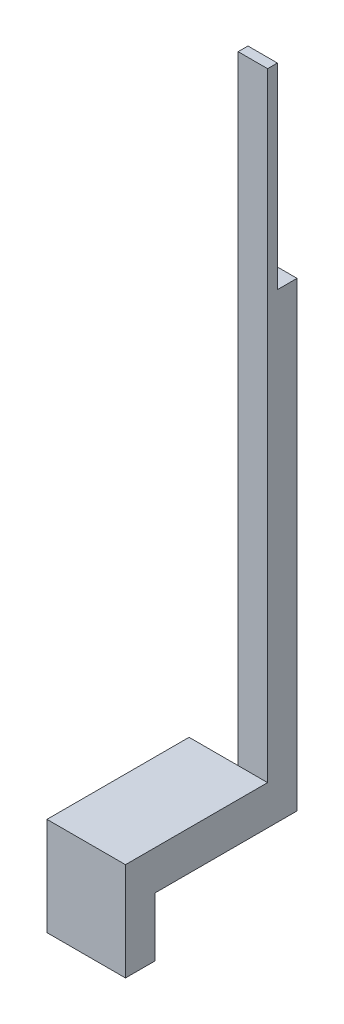
ISO-10303-21;
HEADER;
FILE_DESCRIPTION(('STEP AP214'),'2;1');
FILE_NAME('part.step','',(''),(''),'','','');
FILE_SCHEMA(('AUTOMOTIVE_DESIGN { 1 0 10303 214 1 1 1 1 }'));
ENDSEC;
DATA;
#1=APPLICATION_CONTEXT('core data for automotive mechanical design processes');
#2=APPLICATION_PROTOCOL_DEFINITION('international standard','automotive_design',2000,#1);
#3=PRODUCT_CONTEXT('',#1,'mechanical');
#4=PRODUCT('Part','Part','',(#3));
#5=PRODUCT_RELATED_PRODUCT_CATEGORY('part','',(#4));
#6=PRODUCT_DEFINITION_FORMATION('','',#4);
#7=PRODUCT_DEFINITION_CONTEXT('part definition',#1,'design');
#8=PRODUCT_DEFINITION('design','',#6,#7);
#9=PRODUCT_DEFINITION_SHAPE('','',#8);
#10=(LENGTH_UNIT() NAMED_UNIT(*) SI_UNIT(.MILLI.,.METRE.));
#11=(NAMED_UNIT(*) PLANE_ANGLE_UNIT() SI_UNIT($,.RADIAN.));
#12=(NAMED_UNIT(*) SI_UNIT($,.STERADIAN.) SOLID_ANGLE_UNIT());
#13=UNCERTAINTY_MEASURE_WITH_UNIT(LENGTH_MEASURE(1.E-05),#10,'distance_accuracy_value','');
#14=(GEOMETRIC_REPRESENTATION_CONTEXT(3) GLOBAL_UNCERTAINTY_ASSIGNED_CONTEXT((#13)) GLOBAL_UNIT_ASSIGNED_CONTEXT((#10,
#11,#12)) REPRESENTATION_CONTEXT('',''));
#15=CARTESIAN_POINT('',(0.,0.,0.));
#16=DIRECTION('',(0.,0.,1.));
#17=DIRECTION('',(1.,0.,0.));
#18=AXIS2_PLACEMENT_3D('',#15,#16,#17);
#19=CARTESIAN_POINT('',(0.,0.,3.));
#20=DIRECTION('',(1.,0.,0.));
#21=DIRECTION('',(0.,0.,-1.));
#22=AXIS2_PLACEMENT_3D('',#19,#20,#21);
#23=PLANE('',#22);
#24=DIRECTION('',(0.,-1.,0.));
#25=VECTOR('',#24,1.);
#26=CARTESIAN_POINT('',(0.,4.,3.));
#27=LINE('',#26,#25);
#28=CARTESIAN_POINT('',(0.,4.,3.));
#29=VERTEX_POINT('',#28);
#30=CARTESIAN_POINT('',(0.,0.,3.));
#31=VERTEX_POINT('',#30);
#32=EDGE_CURVE('E146',#29,#31,#27,.T.);
#33=ORIENTED_EDGE('',*,*,#32,.F.);
#34=DIRECTION('',(0.,-1.,0.));
#35=VECTOR('',#34,1.);
#36=CARTESIAN_POINT('',(0.,0.,3.));
#37=LINE('',#36,#35);
#38=CARTESIAN_POINT('',(0.,67.,3.));
#39=VERTEX_POINT('',#38);
#40=EDGE_CURVE('E195',#39,#29,#37,.T.);
#41=ORIENTED_EDGE('',*,*,#40,.F.);
#42=DIRECTION('',(0.,0.,1.));
#43=VECTOR('',#42,1.);
#44=CARTESIAN_POINT('',(0.,67.,3.));
#45=LINE('',#44,#43);
#46=CARTESIAN_POINT('',(0.,67.,2.));
#47=VERTEX_POINT('',#46);
#48=EDGE_CURVE('E177',#47,#39,#45,.T.);
#49=ORIENTED_EDGE('',*,*,#48,.F.);
#50=DIRECTION('',(0.,-1.,0.));
#51=VECTOR('',#50,1.);
#52=CARTESIAN_POINT('',(0.,67.,2.));
#53=LINE('',#52,#51);
#54=CARTESIAN_POINT('',(0.,47.,2.));
#55=VERTEX_POINT('',#54);
#56=EDGE_CURVE('E187',#47,#55,#53,.T.);
#57=ORIENTED_EDGE('',*,*,#56,.T.);
#58=DIRECTION('',(0.,0.,-1.));
#59=VECTOR('',#58,1.);
#60=CARTESIAN_POINT('',(0.,47.,3.));
#61=LINE('',#60,#59);
#62=CARTESIAN_POINT('',(0.,47.,0.));
#63=VERTEX_POINT('',#62);
#64=EDGE_CURVE('E200',#55,#63,#61,.T.);
#65=ORIENTED_EDGE('',*,*,#64,.T.);
#66=DIRECTION('',(0.,-1.,0.));
#67=VECTOR('',#66,1.);
#68=CARTESIAN_POINT('',(0.,0.,0.));
#69=LINE('',#68,#67);
#70=CARTESIAN_POINT('',(0.,0.,0.));
#71=VERTEX_POINT('',#70);
#72=EDGE_CURVE('E194',#63,#71,#69,.T.);
#73=ORIENTED_EDGE('',*,*,#72,.T.);
#74=DIRECTION('',(0.,0.,-1.));
#75=VECTOR('',#74,1.);
#76=CARTESIAN_POINT('',(0.,0.,3.));
#77=LINE('',#76,#75);
#78=EDGE_CURVE('E11',#31,#71,#77,.T.);
#79=ORIENTED_EDGE('',*,*,#78,.F.);
#80=EDGE_LOOP('',(#33,#41,#49,#57,#65,#73,#79));
#81=FACE_BOUND('',#80,.T.);
#82=ADVANCED_FACE('F33',(#81),#23,.F.);
#83=CARTESIAN_POINT('',(0.,0.,3.));
#84=DIRECTION('',(0.,0.,-1.));
#85=DIRECTION('',(-1.,0.,0.));
#86=AXIS2_PLACEMENT_3D('',#83,#84,#85);
#87=PLANE('',#86);
#88=DIRECTION('',(-1.,0.,0.));
#89=VECTOR('',#88,1.);
#90=CARTESIAN_POINT('',(0.,4.,3.));
#91=LINE('',#90,#89);
#92=CARTESIAN_POINT('',(3.,4.,3.));
#93=VERTEX_POINT('',#92);
#94=EDGE_CURVE('E47',#93,#29,#91,.T.);
#95=ORIENTED_EDGE('',*,*,#94,.F.);
#96=DIRECTION('',(0.,1.,0.));
#97=VECTOR('',#96,1.);
#98=CARTESIAN_POINT('',(3.,0.,3.));
#99=LINE('',#98,#97);
#100=CARTESIAN_POINT('',(3.,67.,3.));
#101=VERTEX_POINT('',#100);
#102=EDGE_CURVE('E197',#93,#101,#99,.T.);
#103=ORIENTED_EDGE('',*,*,#102,.T.);
#104=DIRECTION('',(1.,0.,0.));
#105=VECTOR('',#104,1.);
#106=CARTESIAN_POINT('',(0.,67.,3.));
#107=LINE('',#106,#105);
#108=EDGE_CURVE('E180',#39,#101,#107,.T.);
#109=ORIENTED_EDGE('',*,*,#108,.F.);
#110=ORIENTED_EDGE('',*,*,#40,.T.);
#111=EDGE_LOOP('',(#95,#103,#109,#110));
#112=FACE_BOUND('',#111,.T.);
#113=ADVANCED_FACE('F250',(#112),#87,.F.);
#114=CARTESIAN_POINT('',(0.,47.,3.));
#115=DIRECTION('',(0.,-1.,0.));
#116=DIRECTION('',(0.,0.,-1.));
#117=AXIS2_PLACEMENT_3D('',#114,#115,#116);
#118=PLANE('',#117);
#119=DIRECTION('',(-1.,0.,0.));
#120=VECTOR('',#119,1.);
#121=CARTESIAN_POINT('',(0.,47.,2.));
#122=LINE('',#121,#120);
#123=CARTESIAN_POINT('',(3.,47.,2.));
#124=VERTEX_POINT('',#123);
#125=EDGE_CURVE('E55',#124,#55,#122,.T.);
#126=ORIENTED_EDGE('',*,*,#125,.F.);
#127=DIRECTION('',(0.,0.,-1.));
#128=VECTOR('',#127,1.);
#129=CARTESIAN_POINT('',(3.,47.,3.));
#130=LINE('',#129,#128);
#131=CARTESIAN_POINT('',(3.,47.,0.));
#132=VERTEX_POINT('',#131);
#133=EDGE_CURVE('E211',#124,#132,#130,.T.);
#134=ORIENTED_EDGE('',*,*,#133,.T.);
#135=DIRECTION('',(-1.,0.,0.));
#136=VECTOR('',#135,1.);
#137=CARTESIAN_POINT('',(0.,47.,0.));
#138=LINE('',#137,#136);
#139=EDGE_CURVE('E198',#132,#63,#138,.T.);
#140=ORIENTED_EDGE('',*,*,#139,.T.);
#141=ORIENTED_EDGE('',*,*,#64,.F.);
#142=EDGE_LOOP('',(#126,#134,#140,#141));
#143=FACE_BOUND('',#142,.T.);
#144=ADVANCED_FACE('F222',(#143),#118,.F.);
#145=CARTESIAN_POINT('',(0.,0.,3.));
#146=DIRECTION('',(0.,1.,0.));
#147=DIRECTION('',(0.,0.,1.));
#148=AXIS2_PLACEMENT_3D('',#145,#146,#147);
#149=PLANE('',#148);
#150=DIRECTION('',(1.,0.,0.));
#151=VECTOR('',#150,1.);
#152=CARTESIAN_POINT('',(0.,0.,0.));
#153=LINE('',#152,#151);
#154=CARTESIAN_POINT('',(3.,0.,0.));
#155=VERTEX_POINT('',#154);
#156=EDGE_CURVE('E203',#71,#155,#153,.T.);
#157=ORIENTED_EDGE('',*,*,#156,.T.);
#158=DIRECTION('',(0.,0.,-1.));
#159=VECTOR('',#158,1.);
#160=CARTESIAN_POINT('',(3.,0.,3.));
#161=LINE('',#160,#159);
#162=CARTESIAN_POINT('',(3.,0.,14.48));
#163=VERTEX_POINT('',#162);
#164=EDGE_CURVE('E40',#163,#155,#161,.T.);
#165=ORIENTED_EDGE('',*,*,#164,.F.);
#166=DIRECTION('',(1.,0.,0.));
#167=VECTOR('',#166,1.);
#168=CARTESIAN_POINT('',(0.,0.,14.48));
#169=LINE('',#168,#167);
#170=CARTESIAN_POINT('',(-5.,0.,14.48));
#171=VERTEX_POINT('',#170);
#172=EDGE_CURVE('E171',#171,#163,#169,.T.);
#173=ORIENTED_EDGE('',*,*,#172,.F.);
#174=DIRECTION('',(0.,0.,1.));
#175=VECTOR('',#174,1.);
#176=CARTESIAN_POINT('',(-5.,0.,14.48));
#177=LINE('',#176,#175);
#178=CARTESIAN_POINT('',(-5.,0.,3.));
#179=VERTEX_POINT('',#178);
#180=EDGE_CURVE('E145',#179,#171,#177,.T.);
#181=ORIENTED_EDGE('',*,*,#180,.F.);
#182=DIRECTION('',(1.,0.,0.));
#183=VECTOR('',#182,1.);
#184=CARTESIAN_POINT('',(-5.,0.,3.));
#185=LINE('',#184,#183);
#186=EDGE_CURVE('E156',#179,#31,#185,.T.);
#187=ORIENTED_EDGE('',*,*,#186,.T.);
#188=ORIENTED_EDGE('',*,*,#78,.T.);
#189=EDGE_LOOP('',(#157,#165,#173,#181,#187,#188));
#190=FACE_BOUND('',#189,.T.);
#191=ADVANCED_FACE('F243',(#190),#149,.F.);
#192=CARTESIAN_POINT('',(3.,0.,3.));
#193=DIRECTION('',(-1.,0.,0.));
#194=DIRECTION('',(0.,0.,1.));
#195=AXIS2_PLACEMENT_3D('',#192,#193,#194);
#196=PLANE('',#195);
#197=DIRECTION('',(0.,1.,0.));
#198=VECTOR('',#197,1.);
#199=CARTESIAN_POINT('',(3.,0.,0.));
#200=LINE('',#199,#198);
#201=EDGE_CURVE('E205',#155,#132,#200,.T.);
#202=ORIENTED_EDGE('',*,*,#201,.T.);
#203=ORIENTED_EDGE('',*,*,#133,.F.);
#204=DIRECTION('',(0.,-1.,0.));
#205=VECTOR('',#204,1.);
#206=CARTESIAN_POINT('',(3.,67.,2.));
#207=LINE('',#206,#205);
#208=CARTESIAN_POINT('',(3.,67.,2.));
#209=VERTEX_POINT('',#208);
#210=EDGE_CURVE('E191',#209,#124,#207,.T.);
#211=ORIENTED_EDGE('',*,*,#210,.F.);
#212=DIRECTION('',(0.,0.,-1.));
#213=VECTOR('',#212,1.);
#214=CARTESIAN_POINT('',(3.,67.,3.));
#215=LINE('',#214,#213);
#216=EDGE_CURVE('E183',#101,#209,#215,.T.);
#217=ORIENTED_EDGE('',*,*,#216,.F.);
#218=ORIENTED_EDGE('',*,*,#102,.F.);
#219=DIRECTION('',(0.,0.,-1.));
#220=VECTOR('',#219,1.);
#221=CARTESIAN_POINT('',(3.,4.,14.48));
#222=LINE('',#221,#220);
#223=CARTESIAN_POINT('',(3.,4.,17.48));
#224=VERTEX_POINT('',#223);
#225=EDGE_CURVE('E173',#224,#93,#222,.T.);
#226=ORIENTED_EDGE('',*,*,#225,.F.);
#227=DIRECTION('',(0.,1.,0.));
#228=VECTOR('',#227,1.);
#229=CARTESIAN_POINT('',(3.,-6.,17.48));
#230=LINE('',#229,#228);
#231=CARTESIAN_POINT('',(3.,-6.,17.48));
#232=VERTEX_POINT('',#231);
#233=EDGE_CURVE('E129',#232,#224,#230,.T.);
#234=ORIENTED_EDGE('',*,*,#233,.F.);
#235=DIRECTION('',(0.,0.,-1.));
#236=VECTOR('',#235,1.);
#237=CARTESIAN_POINT('',(3.,-6.,14.48));
#238=LINE('',#237,#236);
#239=CARTESIAN_POINT('',(3.,-6.,14.48));
#240=VERTEX_POINT('',#239);
#241=EDGE_CURVE('E130',#232,#240,#238,.T.);
#242=ORIENTED_EDGE('',*,*,#241,.T.);
#243=DIRECTION('',(0.,1.,0.));
#244=VECTOR('',#243,1.);
#245=CARTESIAN_POINT('',(3.,-6.,14.48));
#246=LINE('',#245,#244);
#247=EDGE_CURVE('E125',#240,#163,#246,.T.);
#248=ORIENTED_EDGE('',*,*,#247,.T.);
#249=ORIENTED_EDGE('',*,*,#164,.T.);
#250=EDGE_LOOP('',(#202,#203,#211,#217,#218,#226,#234,#242,#248,#249));
#251=FACE_BOUND('',#250,.T.);
#252=ADVANCED_FACE('F215',(#251),#196,.F.);
#253=CARTESIAN_POINT('',(0.,0.,0.));
#254=DIRECTION('',(0.,0.,-1.));
#255=DIRECTION('',(-1.,0.,0.));
#256=AXIS2_PLACEMENT_3D('',#253,#254,#255);
#257=PLANE('',#256);
#258=ORIENTED_EDGE('',*,*,#72,.F.);
#259=ORIENTED_EDGE('',*,*,#139,.F.);
#260=ORIENTED_EDGE('',*,*,#201,.F.);
#261=ORIENTED_EDGE('',*,*,#156,.F.);
#262=EDGE_LOOP('',(#258,#259,#260,#261));
#263=FACE_BOUND('',#262,.T.);
#264=ADVANCED_FACE('F221',(#263),#257,.T.);
#265=CARTESIAN_POINT('',(0.,67.,2.));
#266=DIRECTION('',(0.,0.,1.));
#267=DIRECTION('',(1.,0.,0.));
#268=AXIS2_PLACEMENT_3D('',#265,#266,#267);
#269=PLANE('',#268);
#270=ORIENTED_EDGE('',*,*,#125,.T.);
#271=ORIENTED_EDGE('',*,*,#56,.F.);
#272=DIRECTION('',(-1.,0.,0.));
#273=VECTOR('',#272,1.);
#274=CARTESIAN_POINT('',(0.,67.,2.));
#275=LINE('',#274,#273);
#276=EDGE_CURVE('E185',#209,#47,#275,.T.);
#277=ORIENTED_EDGE('',*,*,#276,.F.);
#278=ORIENTED_EDGE('',*,*,#210,.T.);
#279=EDGE_LOOP('',(#270,#271,#277,#278));
#280=FACE_BOUND('',#279,.T.);
#281=ADVANCED_FACE('F227',(#280),#269,.F.);
#282=CARTESIAN_POINT('',(0.,67.,0.));
#283=DIRECTION('',(0.,-1.,0.));
#284=DIRECTION('',(0.,0.,-1.));
#285=AXIS2_PLACEMENT_3D('',#282,#283,#284);
#286=PLANE('',#285);
#287=ORIENTED_EDGE('',*,*,#48,.T.);
#288=ORIENTED_EDGE('',*,*,#108,.T.);
#289=ORIENTED_EDGE('',*,*,#216,.T.);
#290=ORIENTED_EDGE('',*,*,#276,.T.);
#291=EDGE_LOOP('',(#287,#288,#289,#290));
#292=FACE_BOUND('',#291,.T.);
#293=ADVANCED_FACE('F231',(#292),#286,.F.);
#294=CARTESIAN_POINT('',(0.,4.,14.48));
#295=DIRECTION('',(0.,-1.,0.));
#296=DIRECTION('',(0.,0.,-1.));
#297=AXIS2_PLACEMENT_3D('',#294,#295,#296);
#298=PLANE('',#297);
#299=ORIENTED_EDGE('',*,*,#94,.T.);
#300=DIRECTION('',(1.,0.,0.));
#301=VECTOR('',#300,1.);
#302=CARTESIAN_POINT('',(-5.,4.,3.));
#303=LINE('',#302,#301);
#304=CARTESIAN_POINT('',(-5.,4.,3.));
#305=VERTEX_POINT('',#304);
#306=EDGE_CURVE('E160',#305,#29,#303,.T.);
#307=ORIENTED_EDGE('',*,*,#306,.F.);
#308=DIRECTION('',(0.,0.,-1.));
#309=VECTOR('',#308,1.);
#310=CARTESIAN_POINT('',(-5.,4.,17.48));
#311=LINE('',#310,#309);
#312=CARTESIAN_POINT('',(-5.,4.,17.48));
#313=VERTEX_POINT('',#312);
#314=EDGE_CURVE('E152',#313,#305,#311,.T.);
#315=ORIENTED_EDGE('',*,*,#314,.F.);
#316=DIRECTION('',(1.,0.,0.));
#317=VECTOR('',#316,1.);
#318=CARTESIAN_POINT('',(0.,4.,17.48));
#319=LINE('',#318,#317);
#320=EDGE_CURVE('E163',#313,#224,#319,.T.);
#321=ORIENTED_EDGE('',*,*,#320,.T.);
#322=ORIENTED_EDGE('',*,*,#225,.T.);
#323=EDGE_LOOP('',(#299,#307,#315,#321,#322));
#324=FACE_BOUND('',#323,.T.);
#325=ADVANCED_FACE('F234',(#324),#298,.F.);
#326=CARTESIAN_POINT('',(0.,-6.,14.48));
#327=DIRECTION('',(0.,0.,-1.));
#328=DIRECTION('',(-1.,0.,0.));
#329=AXIS2_PLACEMENT_3D('',#326,#327,#328);
#330=PLANE('',#329);
#331=DIRECTION('',(-1.,0.,0.));
#332=VECTOR('',#331,1.);
#333=CARTESIAN_POINT('',(0.,-6.,14.48));
#334=LINE('',#333,#332);
#335=CARTESIAN_POINT('',(-5.,-6.,14.48));
#336=VERTEX_POINT('',#335);
#337=EDGE_CURVE('E118',#240,#336,#334,.T.);
#338=ORIENTED_EDGE('',*,*,#337,.T.);
#339=DIRECTION('',(0.,-1.,0.));
#340=VECTOR('',#339,1.);
#341=CARTESIAN_POINT('',(-5.,-6.,14.48));
#342=LINE('',#341,#340);
#343=EDGE_CURVE('E123',#171,#336,#342,.T.);
#344=ORIENTED_EDGE('',*,*,#343,.F.);
#345=ORIENTED_EDGE('',*,*,#172,.T.);
#346=ORIENTED_EDGE('',*,*,#247,.F.);
#347=EDGE_LOOP('',(#338,#344,#345,#346));
#348=FACE_BOUND('',#347,.T.);
#349=ADVANCED_FACE('F120',(#348),#330,.T.);
#350=CARTESIAN_POINT('',(0.,-6.,17.48));
#351=DIRECTION('',(0.,0.,1.));
#352=DIRECTION('',(1.,0.,0.));
#353=AXIS2_PLACEMENT_3D('',#350,#351,#352);
#354=PLANE('',#353);
#355=ORIENTED_EDGE('',*,*,#320,.F.);
#356=DIRECTION('',(0.,1.,0.));
#357=VECTOR('',#356,1.);
#358=CARTESIAN_POINT('',(-5.,-6.,17.48));
#359=LINE('',#358,#357);
#360=CARTESIAN_POINT('',(-5.,-6.,17.48));
#361=VERTEX_POINT('',#360);
#362=EDGE_CURVE('E140',#361,#313,#359,.T.);
#363=ORIENTED_EDGE('',*,*,#362,.F.);
#364=DIRECTION('',(1.,0.,0.));
#365=VECTOR('',#364,1.);
#366=CARTESIAN_POINT('',(0.,-6.,17.48));
#367=LINE('',#366,#365);
#368=EDGE_CURVE('E136',#361,#232,#367,.T.);
#369=ORIENTED_EDGE('',*,*,#368,.T.);
#370=ORIENTED_EDGE('',*,*,#233,.T.);
#371=EDGE_LOOP('',(#355,#363,#369,#370));
#372=FACE_BOUND('',#371,.T.);
#373=ADVANCED_FACE('F238',(#372),#354,.T.);
#374=CARTESIAN_POINT('',(0.,-6.,0.));
#375=DIRECTION('',(0.,1.,0.));
#376=DIRECTION('',(0.,0.,1.));
#377=AXIS2_PLACEMENT_3D('',#374,#375,#376);
#378=PLANE('',#377);
#379=ORIENTED_EDGE('',*,*,#368,.F.);
#380=DIRECTION('',(0.,0.,1.));
#381=VECTOR('',#380,1.);
#382=CARTESIAN_POINT('',(-5.,-6.,14.48));
#383=LINE('',#382,#381);
#384=EDGE_CURVE('E133',#336,#361,#383,.T.);
#385=ORIENTED_EDGE('',*,*,#384,.F.);
#386=ORIENTED_EDGE('',*,*,#337,.F.);
#387=ORIENTED_EDGE('',*,*,#241,.F.);
#388=EDGE_LOOP('',(#379,#385,#386,#387));
#389=FACE_BOUND('',#388,.T.);
#390=ADVANCED_FACE('F134',(#389),#378,.F.);
#391=CARTESIAN_POINT('',(-5.,4.,3.));
#392=DIRECTION('',(0.,0.,1.));
#393=DIRECTION('',(0.,-1.,0.));
#394=AXIS2_PLACEMENT_3D('',#391,#392,#393);
#395=PLANE('',#394);
#396=ORIENTED_EDGE('',*,*,#32,.T.);
#397=ORIENTED_EDGE('',*,*,#186,.F.);
#398=DIRECTION('',(0.,-1.,0.));
#399=VECTOR('',#398,1.);
#400=CARTESIAN_POINT('',(-5.,4.,3.));
#401=LINE('',#400,#399);
#402=EDGE_CURVE('E154',#305,#179,#401,.T.);
#403=ORIENTED_EDGE('',*,*,#402,.F.);
#404=ORIENTED_EDGE('',*,*,#306,.T.);
#405=EDGE_LOOP('',(#396,#397,#403,#404));
#406=FACE_BOUND('',#405,.T.);
#407=ADVANCED_FACE('F242',(#406),#395,.F.);
#408=CARTESIAN_POINT('',(-5.,0.,0.));
#409=DIRECTION('',(-1.,0.,0.));
#410=DIRECTION('',(0.,0.,1.));
#411=AXIS2_PLACEMENT_3D('',#408,#409,#410);
#412=PLANE('',#411);
#413=ORIENTED_EDGE('',*,*,#343,.T.);
#414=ORIENTED_EDGE('',*,*,#384,.T.);
#415=ORIENTED_EDGE('',*,*,#362,.T.);
#416=ORIENTED_EDGE('',*,*,#314,.T.);
#417=ORIENTED_EDGE('',*,*,#402,.T.);
#418=ORIENTED_EDGE('',*,*,#180,.T.);
#419=EDGE_LOOP('',(#413,#414,#415,#416,#417,#418));
#420=FACE_BOUND('',#419,.T.);
#421=ADVANCED_FACE('F143',(#420),#412,.T.);
#422=CLOSED_SHELL('',(#82,#113,#144,#191,#252,#264,#281,#293,#325,#349,#373,#390,#407,#421));
#423=MANIFOLD_SOLID_BREP('B2',#422);
#424=ADVANCED_BREP_SHAPE_REPRESENTATION('',(#18,#423),#14);
#425=SHAPE_DEFINITION_REPRESENTATION(#9,#424);
ENDSEC;
END-ISO-10303-21;
